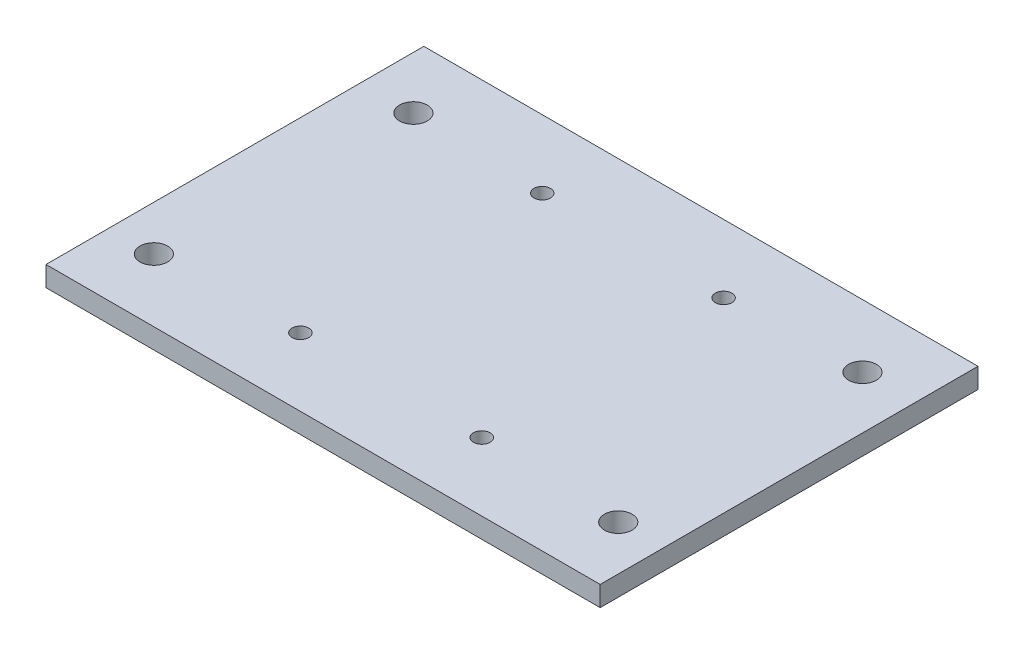
ISO-10303-21;
HEADER;
FILE_DESCRIPTION(('STEP AP214'),'2;1');
FILE_NAME('part.step','',(''),(''),'','','');
FILE_SCHEMA(('AUTOMOTIVE_DESIGN { 1 0 10303 214 1 1 1 1 }'));
ENDSEC;
DATA;
#1=APPLICATION_CONTEXT('core data for automotive mechanical design processes');
#2=APPLICATION_PROTOCOL_DEFINITION('international standard','automotive_design',2000,#1);
#3=PRODUCT_CONTEXT('',#1,'mechanical');
#4=PRODUCT('Part','Part','',(#3));
#5=PRODUCT_RELATED_PRODUCT_CATEGORY('part','',(#4));
#6=PRODUCT_DEFINITION_FORMATION('','',#4);
#7=PRODUCT_DEFINITION_CONTEXT('part definition',#1,'design');
#8=PRODUCT_DEFINITION('design','',#6,#7);
#9=PRODUCT_DEFINITION_SHAPE('','',#8);
#10=(LENGTH_UNIT() NAMED_UNIT(*) SI_UNIT(.MILLI.,.METRE.));
#11=(NAMED_UNIT(*) PLANE_ANGLE_UNIT() SI_UNIT($,.RADIAN.));
#12=(NAMED_UNIT(*) SI_UNIT($,.STERADIAN.) SOLID_ANGLE_UNIT());
#13=UNCERTAINTY_MEASURE_WITH_UNIT(LENGTH_MEASURE(1.E-05),#10,'distance_accuracy_value','');
#14=(GEOMETRIC_REPRESENTATION_CONTEXT(3) GLOBAL_UNCERTAINTY_ASSIGNED_CONTEXT((#13)) GLOBAL_UNIT_ASSIGNED_CONTEXT((#10,
#11,#12)) REPRESENTATION_CONTEXT('',''));
#15=CARTESIAN_POINT('',(0.,0.,0.));
#16=DIRECTION('',(0.,0.,1.));
#17=DIRECTION('',(1.,0.,0.));
#18=AXIS2_PLACEMENT_3D('',#15,#16,#17);
#19=CARTESIAN_POINT('',(0.,4.,0.));
#20=DIRECTION('',(0.,1.,0.));
#21=DIRECTION('',(0.,0.,1.));
#22=AXIS2_PLACEMENT_3D('',#19,#20,#21);
#23=PLANE('',#22);
#24=CARTESIAN_POINT('',(44.57,4.,-25.));
#25=DIRECTION('',(0.,1.,0.));
#26=DIRECTION('',(0.,0.,1.));
#27=AXIS2_PLACEMENT_3D('',#24,#25,#26);
#28=CIRCLE('',#27,2.75);
#29=CARTESIAN_POINT('',(44.57,4.,-22.25));
#30=VERTEX_POINT('',#29);
#31=EDGE_CURVE('E149',#30,#30,#28,.T.);
#32=ORIENTED_EDGE('',*,*,#31,.F.);
#33=EDGE_LOOP('',(#32));
#34=FACE_BOUND('',#33,.T.);
#35=CARTESIAN_POINT('',(-44.57,4.,-25.));
#36=DIRECTION('',(0.,1.,0.));
#37=DIRECTION('',(0.,0.,1.));
#38=AXIS2_PLACEMENT_3D('',#35,#36,#37);
#39=CIRCLE('',#38,2.75);
#40=CARTESIAN_POINT('',(-44.57,4.,-22.25));
#41=VERTEX_POINT('',#40);
#42=EDGE_CURVE('E137',#41,#41,#39,.T.);
#43=ORIENTED_EDGE('',*,*,#42,.F.);
#44=EDGE_LOOP('',(#43));
#45=FACE_BOUND('',#44,.T.);
#46=CARTESIAN_POINT('',(-18.,4.,24.));
#47=DIRECTION('',(0.,1.,0.));
#48=DIRECTION('',(0.,0.,1.));
#49=AXIS2_PLACEMENT_3D('',#46,#47,#48);
#50=CIRCLE('',#49,1.65);
#51=CARTESIAN_POINT('',(-18.,4.,25.65));
#52=VERTEX_POINT('',#51);
#53=EDGE_CURVE('E125',#52,#52,#50,.T.);
#54=ORIENTED_EDGE('',*,*,#53,.F.);
#55=EDGE_LOOP('',(#54));
#56=FACE_BOUND('',#55,.T.);
#57=CARTESIAN_POINT('',(-18.,4.,-24.));
#58=DIRECTION('',(0.,1.,0.));
#59=DIRECTION('',(0.,0.,1.));
#60=AXIS2_PLACEMENT_3D('',#57,#58,#59);
#61=CIRCLE('',#60,1.65);
#62=CARTESIAN_POINT('',(-18.,4.,-22.35));
#63=VERTEX_POINT('',#62);
#64=EDGE_CURVE('E104',#63,#63,#61,.T.);
#65=ORIENTED_EDGE('',*,*,#64,.F.);
#66=EDGE_LOOP('',(#65));
#67=FACE_BOUND('',#66,.T.);
#68=DIRECTION('',(0.,0.,1.));
#69=VECTOR('',#68,1.);
#70=CARTESIAN_POINT('',(-55.,4.,-37.5));
#71=LINE('',#70,#69);
#72=CARTESIAN_POINT('',(-55.,4.,-37.5));
#73=VERTEX_POINT('',#72);
#74=CARTESIAN_POINT('',(-55.,4.,37.5));
#75=VERTEX_POINT('',#74);
#76=EDGE_CURVE('E89',#73,#75,#71,.T.);
#77=ORIENTED_EDGE('',*,*,#76,.T.);
#78=DIRECTION('',(1.,0.,0.));
#79=VECTOR('',#78,1.);
#80=CARTESIAN_POINT('',(-55.,4.,37.5));
#81=LINE('',#80,#79);
#82=CARTESIAN_POINT('',(55.,4.,37.5));
#83=VERTEX_POINT('',#82);
#84=EDGE_CURVE('E84',#75,#83,#81,.T.);
#85=ORIENTED_EDGE('',*,*,#84,.T.);
#86=DIRECTION('',(0.,0.,-1.));
#87=VECTOR('',#86,1.);
#88=CARTESIAN_POINT('',(55.,4.,-37.5));
#89=LINE('',#88,#87);
#90=CARTESIAN_POINT('',(55.,4.,-37.5));
#91=VERTEX_POINT('',#90);
#92=EDGE_CURVE('E87',#83,#91,#89,.T.);
#93=ORIENTED_EDGE('',*,*,#92,.T.);
#94=DIRECTION('',(-1.,0.,0.));
#95=VECTOR('',#94,1.);
#96=CARTESIAN_POINT('',(-55.,4.,-37.5));
#97=LINE('',#96,#95);
#98=EDGE_CURVE('E54',#91,#73,#97,.T.);
#99=ORIENTED_EDGE('',*,*,#98,.T.);
#100=EDGE_LOOP('',(#77,#85,#93,#99));
#101=FACE_BOUND('',#100,.T.);
#102=CARTESIAN_POINT('',(18.,4.,-24.));
#103=DIRECTION('',(0.,1.,0.));
#104=DIRECTION('',(0.,0.,1.));
#105=AXIS2_PLACEMENT_3D('',#102,#103,#104);
#106=CIRCLE('',#105,1.65);
#107=CARTESIAN_POINT('',(18.,4.,-22.35));
#108=VERTEX_POINT('',#107);
#109=EDGE_CURVE('E119',#108,#108,#106,.T.);
#110=ORIENTED_EDGE('',*,*,#109,.F.);
#111=EDGE_LOOP('',(#110));
#112=FACE_BOUND('',#111,.T.);
#113=CARTESIAN_POINT('',(18.,4.,24.));
#114=DIRECTION('',(0.,1.,0.));
#115=DIRECTION('',(0.,0.,1.));
#116=AXIS2_PLACEMENT_3D('',#113,#114,#115);
#117=CIRCLE('',#116,1.65);
#118=CARTESIAN_POINT('',(18.,4.,25.65));
#119=VERTEX_POINT('',#118);
#120=EDGE_CURVE('E131',#119,#119,#117,.T.);
#121=ORIENTED_EDGE('',*,*,#120,.F.);
#122=EDGE_LOOP('',(#121));
#123=FACE_BOUND('',#122,.T.);
#124=CARTESIAN_POINT('',(-46.095,4.,25.));
#125=DIRECTION('',(0.,1.,0.));
#126=DIRECTION('',(0.,0.,1.));
#127=AXIS2_PLACEMENT_3D('',#124,#125,#126);
#128=CIRCLE('',#127,2.75);
#129=CARTESIAN_POINT('',(-46.095,4.,27.75));
#130=VERTEX_POINT('',#129);
#131=EDGE_CURVE('E143',#130,#130,#128,.T.);
#132=ORIENTED_EDGE('',*,*,#131,.F.);
#133=EDGE_LOOP('',(#132));
#134=FACE_BOUND('',#133,.T.);
#135=CARTESIAN_POINT('',(46.095,4.,25.));
#136=DIRECTION('',(0.,1.,0.));
#137=DIRECTION('',(0.,0.,1.));
#138=AXIS2_PLACEMENT_3D('',#135,#136,#137);
#139=CIRCLE('',#138,2.75);
#140=CARTESIAN_POINT('',(46.095,4.,27.75));
#141=VERTEX_POINT('',#140);
#142=EDGE_CURVE('E155',#141,#141,#139,.T.);
#143=ORIENTED_EDGE('',*,*,#142,.F.);
#144=EDGE_LOOP('',(#143));
#145=FACE_BOUND('',#144,.T.);
#146=ADVANCED_FACE('F37',(#34,#45,#56,#67,#101,#112,#123,#134,#145),#23,.T.);
#147=CARTESIAN_POINT('',(0.,0.,0.));
#148=DIRECTION('',(0.,1.,0.));
#149=DIRECTION('',(0.,0.,1.));
#150=AXIS2_PLACEMENT_3D('',#147,#148,#149);
#151=PLANE('',#150);
#152=DIRECTION('',(0.,0.,1.));
#153=VECTOR('',#152,1.);
#154=CARTESIAN_POINT('',(-55.,0.,-37.5));
#155=LINE('',#154,#153);
#156=CARTESIAN_POINT('',(-55.,0.,-37.5));
#157=VERTEX_POINT('',#156);
#158=CARTESIAN_POINT('',(-55.,0.,37.5));
#159=VERTEX_POINT('',#158);
#160=EDGE_CURVE('E101',#157,#159,#155,.T.);
#161=ORIENTED_EDGE('',*,*,#160,.F.);
#162=DIRECTION('',(-1.,0.,0.));
#163=VECTOR('',#162,1.);
#164=CARTESIAN_POINT('',(-55.,0.,-37.5));
#165=LINE('',#164,#163);
#166=CARTESIAN_POINT('',(55.,0.,-37.5));
#167=VERTEX_POINT('',#166);
#168=EDGE_CURVE('E77',#167,#157,#165,.T.);
#169=ORIENTED_EDGE('',*,*,#168,.F.);
#170=DIRECTION('',(0.,0.,-1.));
#171=VECTOR('',#170,1.);
#172=CARTESIAN_POINT('',(55.,0.,-37.5));
#173=LINE('',#172,#171);
#174=CARTESIAN_POINT('',(55.,0.,37.5));
#175=VERTEX_POINT('',#174);
#176=EDGE_CURVE('E71',#175,#167,#173,.T.);
#177=ORIENTED_EDGE('',*,*,#176,.F.);
#178=DIRECTION('',(1.,0.,0.));
#179=VECTOR('',#178,1.);
#180=CARTESIAN_POINT('',(-55.,0.,37.5));
#181=LINE('',#180,#179);
#182=EDGE_CURVE('E93',#159,#175,#181,.T.);
#183=ORIENTED_EDGE('',*,*,#182,.F.);
#184=EDGE_LOOP('',(#161,#169,#177,#183));
#185=FACE_BOUND('',#184,.T.);
#186=CARTESIAN_POINT('',(-18.,0.,-24.));
#187=DIRECTION('',(0.,1.,0.));
#188=DIRECTION('',(0.,0.,1.));
#189=AXIS2_PLACEMENT_3D('',#186,#187,#188);
#190=CIRCLE('',#189,1.65);
#191=CARTESIAN_POINT('',(-18.,0.,-22.35));
#192=VERTEX_POINT('',#191);
#193=EDGE_CURVE('E116',#192,#192,#190,.T.);
#194=ORIENTED_EDGE('',*,*,#193,.T.);
#195=EDGE_LOOP('',(#194));
#196=FACE_BOUND('',#195,.T.);
#197=CARTESIAN_POINT('',(18.,0.,-24.));
#198=DIRECTION('',(0.,1.,0.));
#199=DIRECTION('',(0.,0.,1.));
#200=AXIS2_PLACEMENT_3D('',#197,#198,#199);
#201=CIRCLE('',#200,1.65);
#202=CARTESIAN_POINT('',(18.,0.,-22.35));
#203=VERTEX_POINT('',#202);
#204=EDGE_CURVE('E122',#203,#203,#201,.T.);
#205=ORIENTED_EDGE('',*,*,#204,.T.);
#206=EDGE_LOOP('',(#205));
#207=FACE_BOUND('',#206,.T.);
#208=CARTESIAN_POINT('',(-18.,0.,24.));
#209=DIRECTION('',(0.,1.,0.));
#210=DIRECTION('',(0.,0.,1.));
#211=AXIS2_PLACEMENT_3D('',#208,#209,#210);
#212=CIRCLE('',#211,1.65);
#213=CARTESIAN_POINT('',(-18.,0.,25.65));
#214=VERTEX_POINT('',#213);
#215=EDGE_CURVE('E128',#214,#214,#212,.T.);
#216=ORIENTED_EDGE('',*,*,#215,.T.);
#217=EDGE_LOOP('',(#216));
#218=FACE_BOUND('',#217,.T.);
#219=CARTESIAN_POINT('',(18.,0.,24.));
#220=DIRECTION('',(0.,1.,0.));
#221=DIRECTION('',(0.,0.,1.));
#222=AXIS2_PLACEMENT_3D('',#219,#220,#221);
#223=CIRCLE('',#222,1.65);
#224=CARTESIAN_POINT('',(18.,0.,25.65));
#225=VERTEX_POINT('',#224);
#226=EDGE_CURVE('E134',#225,#225,#223,.T.);
#227=ORIENTED_EDGE('',*,*,#226,.T.);
#228=EDGE_LOOP('',(#227));
#229=FACE_BOUND('',#228,.T.);
#230=CARTESIAN_POINT('',(-44.57,0.,-25.));
#231=DIRECTION('',(0.,1.,0.));
#232=DIRECTION('',(0.,0.,1.));
#233=AXIS2_PLACEMENT_3D('',#230,#231,#232);
#234=CIRCLE('',#233,2.75);
#235=CARTESIAN_POINT('',(-44.57,0.,-22.25));
#236=VERTEX_POINT('',#235);
#237=EDGE_CURVE('E140',#236,#236,#234,.T.);
#238=ORIENTED_EDGE('',*,*,#237,.T.);
#239=EDGE_LOOP('',(#238));
#240=FACE_BOUND('',#239,.T.);
#241=CARTESIAN_POINT('',(-46.095,0.,25.));
#242=DIRECTION('',(0.,1.,0.));
#243=DIRECTION('',(0.,0.,1.));
#244=AXIS2_PLACEMENT_3D('',#241,#242,#243);
#245=CIRCLE('',#244,2.75);
#246=CARTESIAN_POINT('',(-46.095,0.,27.75));
#247=VERTEX_POINT('',#246);
#248=EDGE_CURVE('E146',#247,#247,#245,.T.);
#249=ORIENTED_EDGE('',*,*,#248,.T.);
#250=EDGE_LOOP('',(#249));
#251=FACE_BOUND('',#250,.T.);
#252=CARTESIAN_POINT('',(44.57,0.,-25.));
#253=DIRECTION('',(0.,1.,0.));
#254=DIRECTION('',(0.,0.,1.));
#255=AXIS2_PLACEMENT_3D('',#252,#253,#254);
#256=CIRCLE('',#255,2.75);
#257=CARTESIAN_POINT('',(44.57,0.,-22.25));
#258=VERTEX_POINT('',#257);
#259=EDGE_CURVE('E152',#258,#258,#256,.T.);
#260=ORIENTED_EDGE('',*,*,#259,.T.);
#261=EDGE_LOOP('',(#260));
#262=FACE_BOUND('',#261,.T.);
#263=CARTESIAN_POINT('',(46.095,0.,25.));
#264=DIRECTION('',(0.,1.,0.));
#265=DIRECTION('',(0.,0.,1.));
#266=AXIS2_PLACEMENT_3D('',#263,#264,#265);
#267=CIRCLE('',#266,2.75);
#268=CARTESIAN_POINT('',(46.095,0.,27.75));
#269=VERTEX_POINT('',#268);
#270=EDGE_CURVE('E158',#269,#269,#267,.T.);
#271=ORIENTED_EDGE('',*,*,#270,.T.);
#272=EDGE_LOOP('',(#271));
#273=FACE_BOUND('',#272,.T.);
#274=ADVANCED_FACE('F112',(#185,#196,#207,#218,#229,#240,#251,#262,#273),#151,.F.);
#275=CARTESIAN_POINT('',(-55.,4.,-37.5));
#276=DIRECTION('',(1.,0.,0.));
#277=DIRECTION('',(0.,0.,-1.));
#278=AXIS2_PLACEMENT_3D('',#275,#276,#277);
#279=PLANE('',#278);
#280=ORIENTED_EDGE('',*,*,#160,.T.);
#281=DIRECTION('',(0.,-1.,0.));
#282=VECTOR('',#281,1.);
#283=CARTESIAN_POINT('',(-55.,4.,37.5));
#284=LINE('',#283,#282);
#285=EDGE_CURVE('E11',#75,#159,#284,.T.);
#286=ORIENTED_EDGE('',*,*,#285,.F.);
#287=ORIENTED_EDGE('',*,*,#76,.F.);
#288=DIRECTION('',(0.,-1.,0.));
#289=VECTOR('',#288,1.);
#290=CARTESIAN_POINT('',(-55.,4.,-37.5));
#291=LINE('',#290,#289);
#292=EDGE_CURVE('E97',#73,#157,#291,.T.);
#293=ORIENTED_EDGE('',*,*,#292,.T.);
#294=EDGE_LOOP('',(#280,#286,#287,#293));
#295=FACE_BOUND('',#294,.T.);
#296=ADVANCED_FACE('F39',(#295),#279,.F.);
#297=CARTESIAN_POINT('',(-55.,4.,37.5));
#298=DIRECTION('',(0.,0.,-1.));
#299=DIRECTION('',(-1.,0.,0.));
#300=AXIS2_PLACEMENT_3D('',#297,#298,#299);
#301=PLANE('',#300);
#302=ORIENTED_EDGE('',*,*,#182,.T.);
#303=DIRECTION('',(0.,-1.,0.));
#304=VECTOR('',#303,1.);
#305=CARTESIAN_POINT('',(55.,4.,37.5));
#306=LINE('',#305,#304);
#307=EDGE_CURVE('E46',#83,#175,#306,.T.);
#308=ORIENTED_EDGE('',*,*,#307,.F.);
#309=ORIENTED_EDGE('',*,*,#84,.F.);
#310=ORIENTED_EDGE('',*,*,#285,.T.);
#311=EDGE_LOOP('',(#302,#308,#309,#310));
#312=FACE_BOUND('',#311,.T.);
#313=ADVANCED_FACE('F92',(#312),#301,.F.);
#314=CARTESIAN_POINT('',(55.,4.,-37.5));
#315=DIRECTION('',(-1.,0.,0.));
#316=DIRECTION('',(0.,0.,1.));
#317=AXIS2_PLACEMENT_3D('',#314,#315,#316);
#318=PLANE('',#317);
#319=ORIENTED_EDGE('',*,*,#176,.T.);
#320=DIRECTION('',(0.,-1.,0.));
#321=VECTOR('',#320,1.);
#322=CARTESIAN_POINT('',(55.,4.,-37.5));
#323=LINE('',#322,#321);
#324=EDGE_CURVE('E94',#91,#167,#323,.T.);
#325=ORIENTED_EDGE('',*,*,#324,.F.);
#326=ORIENTED_EDGE('',*,*,#92,.F.);
#327=ORIENTED_EDGE('',*,*,#307,.T.);
#328=EDGE_LOOP('',(#319,#325,#326,#327));
#329=FACE_BOUND('',#328,.T.);
#330=ADVANCED_FACE('F95',(#329),#318,.F.);
#331=CARTESIAN_POINT('',(-55.,4.,-37.5));
#332=DIRECTION('',(0.,0.,1.));
#333=DIRECTION('',(1.,0.,0.));
#334=AXIS2_PLACEMENT_3D('',#331,#332,#333);
#335=PLANE('',#334);
#336=ORIENTED_EDGE('',*,*,#168,.T.);
#337=ORIENTED_EDGE('',*,*,#292,.F.);
#338=ORIENTED_EDGE('',*,*,#98,.F.);
#339=ORIENTED_EDGE('',*,*,#324,.T.);
#340=EDGE_LOOP('',(#336,#337,#338,#339));
#341=FACE_BOUND('',#340,.T.);
#342=ADVANCED_FACE('F109',(#341),#335,.F.);
#343=CARTESIAN_POINT('',(-18.,4.,-24.));
#344=DIRECTION('',(0.,-1.,0.));
#345=DIRECTION('',(0.,0.,-1.));
#346=AXIS2_PLACEMENT_3D('',#343,#344,#345);
#347=CYLINDRICAL_SURFACE('',#346,1.65);
#348=ORIENTED_EDGE('',*,*,#64,.T.);
#349=EDGE_LOOP('',(#348));
#350=FACE_BOUND('',#349,.T.);
#351=ORIENTED_EDGE('',*,*,#193,.F.);
#352=EDGE_LOOP('',(#351));
#353=FACE_BOUND('',#352,.T.);
#354=ADVANCED_FACE('F177',(#350,#353),#347,.F.);
#355=CARTESIAN_POINT('',(18.,4.,-24.));
#356=DIRECTION('',(0.,-1.,0.));
#357=DIRECTION('',(0.,0.,-1.));
#358=AXIS2_PLACEMENT_3D('',#355,#356,#357);
#359=CYLINDRICAL_SURFACE('',#358,1.65);
#360=ORIENTED_EDGE('',*,*,#109,.T.);
#361=EDGE_LOOP('',(#360));
#362=FACE_BOUND('',#361,.T.);
#363=ORIENTED_EDGE('',*,*,#204,.F.);
#364=EDGE_LOOP('',(#363));
#365=FACE_BOUND('',#364,.T.);
#366=ADVANCED_FACE('F223',(#362,#365),#359,.F.);
#367=CARTESIAN_POINT('',(-18.,4.,24.));
#368=DIRECTION('',(0.,-1.,0.));
#369=DIRECTION('',(0.,0.,-1.));
#370=AXIS2_PLACEMENT_3D('',#367,#368,#369);
#371=CYLINDRICAL_SURFACE('',#370,1.65);
#372=ORIENTED_EDGE('',*,*,#53,.T.);
#373=EDGE_LOOP('',(#372));
#374=FACE_BOUND('',#373,.T.);
#375=ORIENTED_EDGE('',*,*,#215,.F.);
#376=EDGE_LOOP('',(#375));
#377=FACE_BOUND('',#376,.T.);
#378=ADVANCED_FACE('F231',(#374,#377),#371,.F.);
#379=CARTESIAN_POINT('',(18.,4.,24.));
#380=DIRECTION('',(0.,-1.,0.));
#381=DIRECTION('',(0.,0.,-1.));
#382=AXIS2_PLACEMENT_3D('',#379,#380,#381);
#383=CYLINDRICAL_SURFACE('',#382,1.65);
#384=ORIENTED_EDGE('',*,*,#120,.T.);
#385=EDGE_LOOP('',(#384));
#386=FACE_BOUND('',#385,.T.);
#387=ORIENTED_EDGE('',*,*,#226,.F.);
#388=EDGE_LOOP('',(#387));
#389=FACE_BOUND('',#388,.T.);
#390=ADVANCED_FACE('F239',(#386,#389),#383,.F.);
#391=CARTESIAN_POINT('',(-44.57,4.,-25.));
#392=DIRECTION('',(0.,-1.,0.));
#393=DIRECTION('',(0.,0.,-1.));
#394=AXIS2_PLACEMENT_3D('',#391,#392,#393);
#395=CYLINDRICAL_SURFACE('',#394,2.75);
#396=ORIENTED_EDGE('',*,*,#42,.T.);
#397=EDGE_LOOP('',(#396));
#398=FACE_BOUND('',#397,.T.);
#399=ORIENTED_EDGE('',*,*,#237,.F.);
#400=EDGE_LOOP('',(#399));
#401=FACE_BOUND('',#400,.T.);
#402=ADVANCED_FACE('F248',(#398,#401),#395,.F.);
#403=CARTESIAN_POINT('',(-46.095,4.,25.));
#404=DIRECTION('',(0.,-1.,0.));
#405=DIRECTION('',(0.,0.,-1.));
#406=AXIS2_PLACEMENT_3D('',#403,#404,#405);
#407=CYLINDRICAL_SURFACE('',#406,2.75);
#408=ORIENTED_EDGE('',*,*,#131,.T.);
#409=EDGE_LOOP('',(#408));
#410=FACE_BOUND('',#409,.T.);
#411=ORIENTED_EDGE('',*,*,#248,.F.);
#412=EDGE_LOOP('',(#411));
#413=FACE_BOUND('',#412,.T.);
#414=ADVANCED_FACE('F257',(#410,#413),#407,.F.);
#415=CARTESIAN_POINT('',(44.57,4.,-25.));
#416=DIRECTION('',(0.,-1.,0.));
#417=DIRECTION('',(0.,0.,-1.));
#418=AXIS2_PLACEMENT_3D('',#415,#416,#417);
#419=CYLINDRICAL_SURFACE('',#418,2.75);
#420=ORIENTED_EDGE('',*,*,#31,.T.);
#421=EDGE_LOOP('',(#420));
#422=FACE_BOUND('',#421,.T.);
#423=ORIENTED_EDGE('',*,*,#259,.F.);
#424=EDGE_LOOP('',(#423));
#425=FACE_BOUND('',#424,.T.);
#426=ADVANCED_FACE('F266',(#422,#425),#419,.F.);
#427=CARTESIAN_POINT('',(46.095,4.,25.));
#428=DIRECTION('',(0.,-1.,0.));
#429=DIRECTION('',(0.,0.,-1.));
#430=AXIS2_PLACEMENT_3D('',#427,#428,#429);
#431=CYLINDRICAL_SURFACE('',#430,2.75);
#432=ORIENTED_EDGE('',*,*,#142,.T.);
#433=EDGE_LOOP('',(#432));
#434=FACE_BOUND('',#433,.T.);
#435=ORIENTED_EDGE('',*,*,#270,.F.);
#436=EDGE_LOOP('',(#435));
#437=FACE_BOUND('',#436,.T.);
#438=ADVANCED_FACE('F164',(#434,#437),#431,.F.);
#439=CLOSED_SHELL('',(#146,#274,#296,#313,#330,#342,#354,#366,#378,#390,#402,#414,#426,#438));
#440=MANIFOLD_SOLID_BREP('B2',#439);
#441=ADVANCED_BREP_SHAPE_REPRESENTATION('',(#18,#440),#14);
#442=SHAPE_DEFINITION_REPRESENTATION(#9,#441);
ENDSEC;
END-ISO-10303-21;
